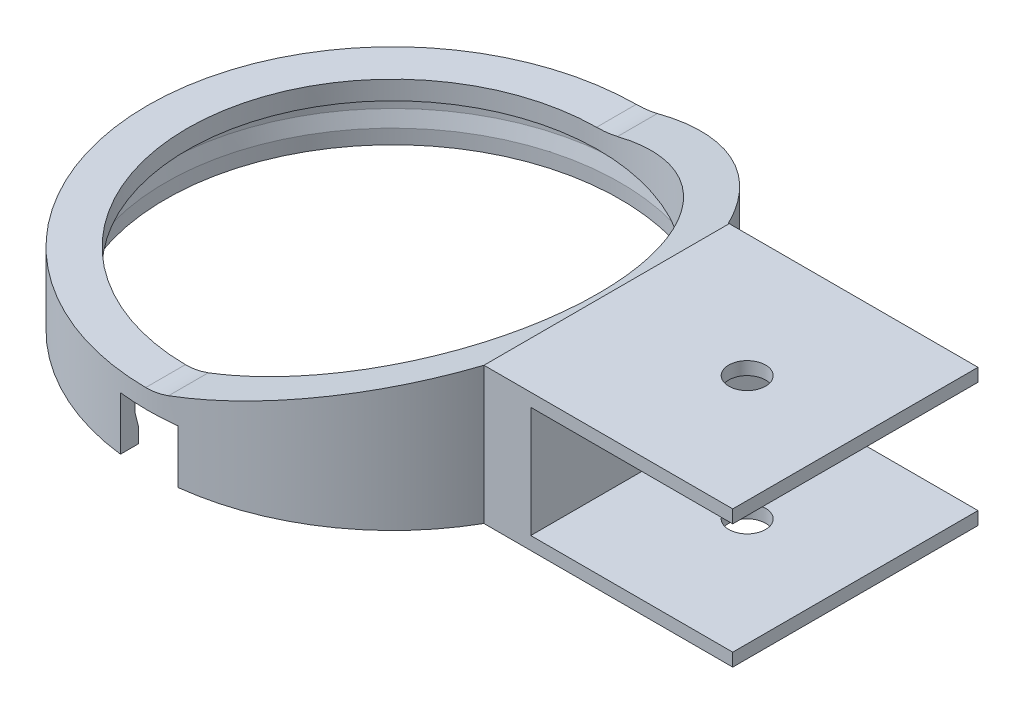
ISO-10303-21;
HEADER;
FILE_DESCRIPTION(('STEP AP214'),'2;1');
FILE_NAME('part.step','',(''),(''),'','','');
FILE_SCHEMA(('AUTOMOTIVE_DESIGN { 1 0 10303 214 1 1 1 1 }'));
ENDSEC;
DATA;
#1=APPLICATION_CONTEXT('core data for automotive mechanical design processes');
#2=APPLICATION_PROTOCOL_DEFINITION('international standard','automotive_design',2000,#1);
#3=PRODUCT_CONTEXT('',#1,'mechanical');
#4=PRODUCT('Part','Part','',(#3));
#5=PRODUCT_RELATED_PRODUCT_CATEGORY('part','',(#4));
#6=PRODUCT_DEFINITION_FORMATION('','',#4);
#7=PRODUCT_DEFINITION_CONTEXT('part definition',#1,'design');
#8=PRODUCT_DEFINITION('design','',#6,#7);
#9=PRODUCT_DEFINITION_SHAPE('','',#8);
#10=(LENGTH_UNIT() NAMED_UNIT(*) SI_UNIT(.MILLI.,.METRE.));
#11=(NAMED_UNIT(*) PLANE_ANGLE_UNIT() SI_UNIT($,.RADIAN.));
#12=(NAMED_UNIT(*) SI_UNIT($,.STERADIAN.) SOLID_ANGLE_UNIT());
#13=UNCERTAINTY_MEASURE_WITH_UNIT(LENGTH_MEASURE(1.E-05),#10,'distance_accuracy_value','');
#14=(GEOMETRIC_REPRESENTATION_CONTEXT(3) GLOBAL_UNCERTAINTY_ASSIGNED_CONTEXT((#13)) GLOBAL_UNIT_ASSIGNED_CONTEXT((#10,
#11,#12)) REPRESENTATION_CONTEXT('',''));
#15=CARTESIAN_POINT('',(0.,0.,0.));
#16=DIRECTION('',(0.,0.,1.));
#17=DIRECTION('',(1.,0.,0.));
#18=AXIS2_PLACEMENT_3D('',#15,#16,#17);
#19=CARTESIAN_POINT('',(81.28,0.,0.));
#20=DIRECTION('',(-1.,0.,0.));
#21=DIRECTION('',(0.,0.,1.));
#22=AXIS2_PLACEMENT_3D('',#19,#20,#21);
#23=PLANE('',#22);
#24=DIRECTION('',(0.,1.,0.));
#25=VECTOR('',#24,1.);
#26=CARTESIAN_POINT('',(81.28,14.732,-21.7399323695097));
#27=LINE('',#26,#25);
#28=CARTESIAN_POINT('',(81.28,-9.398,-21.7399323695097));
#29=VERTEX_POINT('',#28);
#30=CARTESIAN_POINT('',(81.28,-7.11200000000001,-21.7399323695097));
#31=VERTEX_POINT('',#30);
#32=EDGE_CURVE('E203',#29,#31,#27,.T.);
#33=ORIENTED_EDGE('',*,*,#32,.T.);
#34=DIRECTION('',(0.,0.,-1.));
#35=VECTOR('',#34,1.);
#36=CARTESIAN_POINT('',(81.28,-7.11200000000001,19.1540676304903));
#37=LINE('',#36,#35);
#38=CARTESIAN_POINT('',(81.28,-7.11200000000001,21.4400676304903));
#39=VERTEX_POINT('',#38);
#40=EDGE_CURVE('E178',#39,#31,#37,.T.);
#41=ORIENTED_EDGE('',*,*,#40,.F.);
#42=DIRECTION('',(0.,-1.,0.));
#43=VECTOR('',#42,1.);
#44=CARTESIAN_POINT('',(81.28,-9.39800000000001,21.4400676304903));
#45=LINE('',#44,#43);
#46=CARTESIAN_POINT('',(81.28,-9.39800000000001,21.4400676304903));
#47=VERTEX_POINT('',#46);
#48=EDGE_CURVE('E195',#39,#47,#45,.T.);
#49=ORIENTED_EDGE('',*,*,#48,.T.);
#50=DIRECTION('',(0.,0.,-1.));
#51=VECTOR('',#50,1.);
#52=CARTESIAN_POINT('',(81.28,-9.398,-21.7399323695097));
#53=LINE('',#52,#51);
#54=EDGE_CURVE('E194',#47,#29,#53,.T.);
#55=ORIENTED_EDGE('',*,*,#54,.T.);
#56=EDGE_LOOP('',(#33,#41,#49,#55));
#57=FACE_BOUND('',#56,.T.);
#58=ADVANCED_FACE('F35',(#57),#23,.F.);
#59=CARTESIAN_POINT('',(0.,2.54,0.));
#60=DIRECTION('',(0.,-1.,0.));
#61=DIRECTION('',(0.,0.,-1.));
#62=AXIS2_PLACEMENT_3D('',#59,#60,#61);
#63=CYLINDRICAL_SURFACE('',#62,43.18);
#64=DIRECTION('',(0.,-1.,0.));
#65=VECTOR('',#64,1.);
#66=CARTESIAN_POINT('',(37.4811405909692,2.54,21.4400676304903));
#67=LINE('',#66,#65);
#68=CARTESIAN_POINT('',(37.4811405909692,14.732,21.4400676304903));
#69=VERTEX_POINT('',#68);
#70=CARTESIAN_POINT('',(37.4811405909692,-9.39800000000001,21.4400676304903));
#71=VERTEX_POINT('',#70);
#72=EDGE_CURVE('E207',#69,#71,#67,.T.);
#73=ORIENTED_EDGE('',*,*,#72,.F.);
#74=CARTESIAN_POINT('',(0.,2.77504537316538,0.));
#75=DIRECTION('',(0.303922257004754,-0.952696836195616,0.));
#76=DIRECTION('',(-0.952696836195616,-0.303922257004754,0.));
#77=AXIS2_PLACEMENT_3D('',#74,#75,#76);
#78=ELLIPSE('',#77,45.3239670370165,43.18);
#79=CARTESIAN_POINT('',(3.53498559968209,3.90275018031569,43.0350586941628));
#80=VERTEX_POINT('',#79);
#81=EDGE_CURVE('E368',#69,#80,#78,.T.);
#82=ORIENTED_EDGE('',*,*,#81,.T.);
#83=CARTESIAN_POINT('',(3.53498559968207,3.90275018031568,43.0350586941628));
#84=CARTESIAN_POINT('',(3.22329552847197,3.80328461185892,43.0606883849366));
#85=CARTESIAN_POINT('',(2.90750022065759,3.71584549613488,43.0831924459342));
#86=CARTESIAN_POINT('',(2.27175021436152,3.56602113296972,43.1213606609253));
#87=CARTESIAN_POINT('',(1.95183485287706,3.50347975941223,43.1370674941495));
#88=CARTESIAN_POINT('',(1.30786629135085,3.40317095125314,43.1613910578396));
#89=CARTESIAN_POINT('',(0.983813026859318,3.36540390300428,43.170007677735));
#90=CARTESIAN_POINT('',(0.331566724703802,3.31472101850829,43.1799743072779));
#91=CARTESIAN_POINT('',(0.00336046589336663,3.30196613620834,43.181277353077));
#92=CARTESIAN_POINT('',(-0.324827064278304,3.302,43.178778206178));
#93=B_SPLINE_CURVE_WITH_KNOTS('',3,(#83,#84,#85,#86,#87,#88,#89,#90,#91,#92),.UNSPECIFIED.,.F.,
.F.,(4,2,2,2,4),(0.,0.984290926234504,1.96230858957677,2.94034150462912,3.92464769882305),.UNSPECIFIED.);
#94=CARTESIAN_POINT('',(-0.324827064278305,3.302,43.178778206178));
#95=VERTEX_POINT('',#94);
#96=EDGE_CURVE('E62',#80,#95,#93,.T.);
#97=ORIENTED_EDGE('',*,*,#96,.T.);
#98=CARTESIAN_POINT('',(0.,3.302,0.));
#99=DIRECTION('',(0.,-1.,0.));
#100=DIRECTION('',(0.,0.,-1.));
#101=AXIS2_PLACEMENT_3D('',#98,#99,#100);
#102=CIRCLE('',#101,43.18);
#103=CARTESIAN_POINT('',(-0.324827064278305,3.302,-43.178778206178));
#104=VERTEX_POINT('',#103);
#105=EDGE_CURVE('E370',#95,#104,#102,.T.);
#106=ORIENTED_EDGE('',*,*,#105,.T.);
#107=CARTESIAN_POINT('',(-0.324827064278305,3.302,-43.178778206178));
#108=CARTESIAN_POINT('',(0.0033604658933656,3.30196613620835,-43.181277353077));
#109=CARTESIAN_POINT('',(0.331566724703801,3.31472101850829,-43.1799743072779));
#110=CARTESIAN_POINT('',(0.983813026859319,3.36540390300428,-43.170007677735));
#111=CARTESIAN_POINT('',(1.30786629135085,3.40317095125314,-43.1613910578396));
#112=CARTESIAN_POINT('',(1.95183485287706,3.50347975941223,-43.1370674941495));
#113=CARTESIAN_POINT('',(2.27175021436152,3.56602113296972,-43.1213606609253));
#114=CARTESIAN_POINT('',(2.90750022065759,3.71584549613488,-43.0831924459342));
#115=CARTESIAN_POINT('',(3.22329552847197,3.80328461185892,-43.0606883849366));
#116=CARTESIAN_POINT('',(3.53498559968208,3.90275018031568,-43.0350586941628));
#117=B_SPLINE_CURVE_WITH_KNOTS('',3,(#107,#108,#109,#110,#111,#112,#113,#114,#115,#116),
.UNSPECIFIED.,.F.,.F.,(4,2,2,2,4),(0.,0.984306194193926,1.96233910924628,2.94035677258854,
3.92464769882305),.UNSPECIFIED.);
#118=CARTESIAN_POINT('',(3.53498559968207,3.90275018031568,-43.0350586941628));
#119=VERTEX_POINT('',#118);
#120=EDGE_CURVE('E11',#104,#119,#117,.T.);
#121=ORIENTED_EDGE('',*,*,#120,.T.);
#122=CARTESIAN_POINT('',(37.3080117477684,14.6767697244172,-21.7399323695097));
#123=VERTEX_POINT('',#122);
#124=EDGE_CURVE('E365',#119,#123,#78,.T.);
#125=ORIENTED_EDGE('',*,*,#124,.T.);
#126=DIRECTION('',(0.,-1.,0.));
#127=VECTOR('',#126,1.);
#128=CARTESIAN_POINT('',(37.3080117477352,2.54,-21.7399323695096));
#129=LINE('',#128,#127);
#130=CARTESIAN_POINT('',(37.3080117477116,-9.398,-21.7399323695097));
#131=VERTEX_POINT('',#130);
#132=EDGE_CURVE('E218',#131,#123,#129,.F.);
#133=ORIENTED_EDGE('',*,*,#132,.F.);
#134=CARTESIAN_POINT('',(0.,-9.39800000000001,0.));
#135=DIRECTION('',(0.,-1.,0.));
#136=DIRECTION('',(0.,0.,-1.));
#137=AXIS2_PLACEMENT_3D('',#134,#135,#136);
#138=CIRCLE('',#137,43.18);
#139=CARTESIAN_POINT('',(-5.08,-9.39800000000001,42.8801352609807));
#140=VERTEX_POINT('',#139);
#141=EDGE_CURVE('E262',#140,#131,#138,.T.);
#142=ORIENTED_EDGE('',*,*,#141,.F.);
#143=DIRECTION('',(0.,-1.,0.));
#144=VECTOR('',#143,1.);
#145=CARTESIAN_POINT('',(-5.08,2.54,42.8801352609807));
#146=LINE('',#145,#144);
#147=CARTESIAN_POINT('',(-5.08,0.,42.8801352609807));
#148=VERTEX_POINT('',#147);
#149=EDGE_CURVE('E247',#140,#148,#146,.F.);
#150=ORIENTED_EDGE('',*,*,#149,.T.);
#151=CARTESIAN_POINT('',(0.,0.,0.));
#152=DIRECTION('',(0.,1.,0.));
#153=DIRECTION('',(-1.,0.,0.));
#154=AXIS2_PLACEMENT_3D('',#151,#152,#153);
#155=CIRCLE('',#154,43.18);
#156=CARTESIAN_POINT('',(5.08,0.,42.8801352609807));
#157=VERTEX_POINT('',#156);
#158=EDGE_CURVE('E250',#148,#157,#155,.T.);
#159=ORIENTED_EDGE('',*,*,#158,.T.);
#160=DIRECTION('',(0.,-1.,0.));
#161=VECTOR('',#160,1.);
#162=CARTESIAN_POINT('',(5.08,2.54,42.8801352609807));
#163=LINE('',#162,#161);
#164=CARTESIAN_POINT('',(5.08,-9.39800000000001,42.8801352609807));
#165=VERTEX_POINT('',#164);
#166=EDGE_CURVE('E238',#165,#157,#163,.F.);
#167=ORIENTED_EDGE('',*,*,#166,.F.);
#168=EDGE_CURVE('E261',#71,#165,#138,.T.);
#169=ORIENTED_EDGE('',*,*,#168,.F.);
#170=EDGE_LOOP('',(#73,#82,#97,#106,#121,#125,#133,#142,#150,#159,#167,#169));
#171=FACE_BOUND('',#170,.T.);
#172=ADVANCED_FACE('F338',(#171),#63,.T.);
#173=CARTESIAN_POINT('',(0.,2.54,0.));
#174=DIRECTION('',(0.,-1.,0.));
#175=DIRECTION('',(0.,0.,-1.));
#176=AXIS2_PLACEMENT_3D('',#173,#174,#175);
#177=CYLINDRICAL_SURFACE('',#176,36.195);
#178=CARTESIAN_POINT('',(0.,2.77504537316538,0.));
#179=DIRECTION('',(0.303922257004754,-0.952696836195616,0.));
#180=DIRECTION('',(-0.952696836195616,-0.303922257004754,0.));
#181=AXIS2_PLACEMENT_3D('',#178,#179,#180);
#182=ELLIPSE('',#181,37.9921488398521,36.195);
#183=CARTESIAN_POINT('',(3.53498559968207,3.90275018031568,-36.0219641581361));
#184=VERTEX_POINT('',#183);
#185=CARTESIAN_POINT('',(3.53498559968207,3.90275018031568,36.0219641581361));
#186=VERTEX_POINT('',#185);
#187=EDGE_CURVE('E367',#184,#186,#182,.T.);
#188=ORIENTED_EDGE('',*,*,#187,.F.);
#189=CARTESIAN_POINT('',(3.53498559968207,3.90275018031568,-36.0219641581361));
#190=CARTESIAN_POINT('',(3.22354671856189,3.80336214986623,-36.0525590280445));
#191=CARTESIAN_POINT('',(2.90790194474935,3.71595247560489,-36.0794244613593));
#192=CARTESIAN_POINT('',(2.27235402958867,3.56615124724148,-36.124987176148));
#193=CARTESIAN_POINT('',(1.95249244772905,3.50359921857052,-36.1437369229716));
#194=CARTESIAN_POINT('',(1.30851394066261,3.40325484168963,-36.1727752809046));
#195=CARTESIAN_POINT('',(0.984396921212478,3.36546304278039,-36.1830637043024));
#196=CARTESIAN_POINT('',(0.331910771987549,3.31473388710472,-36.1949678203337));
#197=CARTESIAN_POINT('',(0.00352769705809773,3.30196242312623,-36.1965257527722));
#198=CARTESIAN_POINT('',(-0.324827064278305,3.302,-36.1935424126779));
#199=B_SPLINE_CURVE_WITH_KNOTS('',3,(#189,#190,#191,#192,#193,#194,#195,#196,#197,#198),
.UNSPECIFIED.,.F.,.F.,(4,2,2,2,4),(0.,0.984784526100825,1.96310402845409,2.94144523389318,
3.92625148897067),.UNSPECIFIED.);
#200=CARTESIAN_POINT('',(-0.324827064278305,3.302,-36.1935424126779));
#201=VERTEX_POINT('',#200);
#202=EDGE_CURVE('E48',#184,#201,#199,.T.);
#203=ORIENTED_EDGE('',*,*,#202,.T.);
#204=CARTESIAN_POINT('',(0.,3.302,0.));
#205=DIRECTION('',(0.,-1.,0.));
#206=DIRECTION('',(0.,0.,-1.));
#207=AXIS2_PLACEMENT_3D('',#204,#205,#206);
#208=CIRCLE('',#207,36.195);
#209=CARTESIAN_POINT('',(-0.324827064278305,3.302,36.1935424126779));
#210=VERTEX_POINT('',#209);
#211=EDGE_CURVE('E396',#210,#201,#208,.T.);
#212=ORIENTED_EDGE('',*,*,#211,.F.);
#213=CARTESIAN_POINT('',(-0.324827064278305,3.302,36.1935424126779));
#214=CARTESIAN_POINT('',(0.00352769705809779,3.30196242312623,36.1965257527722));
#215=CARTESIAN_POINT('',(0.331910771987549,3.31473388710472,36.1949678203337));
#216=CARTESIAN_POINT('',(0.984396921212479,3.36546304278039,36.1830637043024));
#217=CARTESIAN_POINT('',(1.30851394066262,3.40325484168963,36.1727752809046));
#218=CARTESIAN_POINT('',(1.95249244772905,3.50359921857052,36.1437369229716));
#219=CARTESIAN_POINT('',(2.27235402958867,3.56615124724148,36.124987176148));
#220=CARTESIAN_POINT('',(2.90790194474935,3.71595247560489,36.0794244613593));
#221=CARTESIAN_POINT('',(3.22354671856189,3.80336214986623,36.0525590280445));
#222=CARTESIAN_POINT('',(3.53498559968207,3.90275018031568,36.0219641581361));
#223=B_SPLINE_CURVE_WITH_KNOTS('',3,(#213,#214,#215,#216,#217,#218,#219,#220,#221,#222),
.UNSPECIFIED.,.F.,.F.,(4,2,2,2,4),(0.,0.984806255077492,1.96314746051658,2.94146696286984,
3.92625148897067),.UNSPECIFIED.);
#224=EDGE_CURVE('E431',#210,#186,#223,.T.);
#225=ORIENTED_EDGE('',*,*,#224,.T.);
#226=EDGE_LOOP('',(#188,#203,#212,#225));
#227=FACE_BOUND('',#226,.T.);
#228=CARTESIAN_POINT('',(0.,0.,0.));
#229=DIRECTION('',(0.,1.,0.));
#230=DIRECTION('',(0.,0.,1.));
#231=AXIS2_PLACEMENT_3D('',#228,#229,#230);
#232=CIRCLE('',#231,36.195);
#233=CARTESIAN_POINT('',(0.,0.,36.195));
#234=VERTEX_POINT('',#233);
#235=EDGE_CURVE('E268',#234,#234,#232,.T.);
#236=ORIENTED_EDGE('',*,*,#235,.F.);
#237=EDGE_LOOP('',(#236));
#238=FACE_BOUND('',#237,.T.);
#239=ADVANCED_FACE('F344',(#227,#238),#177,.F.);
#240=CARTESIAN_POINT('',(0.,0.,0.));
#241=DIRECTION('',(0.,1.,0.));
#242=DIRECTION('',(0.,0.,1.));
#243=AXIS2_PLACEMENT_3D('',#240,#241,#242);
#244=PLANE('',#243);
#245=DIRECTION('',(0.,0.,1.));
#246=VECTOR('',#245,1.);
#247=CARTESIAN_POINT('',(-5.08,0.,30.48));
#248=LINE('',#247,#246);
#249=CARTESIAN_POINT('',(-5.08,0.,40.3212499806244));
#250=VERTEX_POINT('',#249);
#251=EDGE_CURVE('E224',#250,#148,#248,.T.);
#252=ORIENTED_EDGE('',*,*,#251,.F.);
#253=CARTESIAN_POINT('',(0.,0.,0.));
#254=DIRECTION('',(0.,-1.,0.));
#255=DIRECTION('',(0.,0.,-1.));
#256=AXIS2_PLACEMENT_3D('',#253,#254,#255);
#257=CIRCLE('',#256,40.64);
#258=CARTESIAN_POINT('',(5.08,0.,40.3212499806244));
#259=VERTEX_POINT('',#258);
#260=EDGE_CURVE('E265',#250,#259,#257,.T.);
#261=ORIENTED_EDGE('',*,*,#260,.T.);
#262=DIRECTION('',(0.,0.,1.));
#263=VECTOR('',#262,1.);
#264=CARTESIAN_POINT('',(5.08,0.,30.48));
#265=LINE('',#264,#263);
#266=EDGE_CURVE('E223',#259,#157,#265,.T.);
#267=ORIENTED_EDGE('',*,*,#266,.T.);
#268=ORIENTED_EDGE('',*,*,#158,.F.);
#269=EDGE_LOOP('',(#252,#261,#267,#268));
#270=FACE_BOUND('',#269,.T.);
#271=ORIENTED_EDGE('',*,*,#235,.T.);
#272=EDGE_LOOP('',(#271));
#273=FACE_BOUND('',#272,.T.);
#274=ADVANCED_FACE('F414',(#270,#273),#244,.F.);
#275=CARTESIAN_POINT('',(0.,-4.318,0.));
#276=DIRECTION('',(0.,1.,0.));
#277=DIRECTION('',(0.,0.,1.));
#278=AXIS2_PLACEMENT_3D('',#275,#276,#277);
#279=CYLINDRICAL_SURFACE('',#278,40.64);
#280=DIRECTION('',(0.,1.,0.));
#281=VECTOR('',#280,1.);
#282=CARTESIAN_POINT('',(-5.08,-4.318,40.3212499806244));
#283=LINE('',#282,#281);
#284=CARTESIAN_POINT('',(-5.08,-4.318,40.3212499806244));
#285=VERTEX_POINT('',#284);
#286=EDGE_CURVE('E245',#285,#250,#283,.T.);
#287=ORIENTED_EDGE('',*,*,#286,.F.);
#288=CARTESIAN_POINT('',(0.,-4.318,0.));
#289=DIRECTION('',(0.,-1.,0.));
#290=DIRECTION('',(0.,0.,-1.));
#291=AXIS2_PLACEMENT_3D('',#288,#289,#290);
#292=CIRCLE('',#291,40.64);
#293=CARTESIAN_POINT('',(5.08,-4.318,40.3212499806244));
#294=VERTEX_POINT('',#293);
#295=EDGE_CURVE('E252',#285,#294,#292,.T.);
#296=ORIENTED_EDGE('',*,*,#295,.T.);
#297=DIRECTION('',(0.,1.,0.));
#298=VECTOR('',#297,1.);
#299=CARTESIAN_POINT('',(5.08,-4.318,40.3212499806244));
#300=LINE('',#299,#298);
#301=EDGE_CURVE('E235',#294,#259,#300,.T.);
#302=ORIENTED_EDGE('',*,*,#301,.T.);
#303=ORIENTED_EDGE('',*,*,#260,.F.);
#304=EDGE_LOOP('',(#287,#296,#302,#303));
#305=FACE_BOUND('',#304,.T.);
#306=ADVANCED_FACE('F412',(#305),#279,.F.);
#307=CARTESIAN_POINT('',(0.,-9.39800000000001,0.));
#308=DIRECTION('',(0.,-1.,0.));
#309=DIRECTION('',(0.,0.,-1.));
#310=AXIS2_PLACEMENT_3D('',#307,#308,#309);
#311=PLANE('',#310);
#312=CARTESIAN_POINT('',(62.23,-9.39800000000001,-0.149932369509652));
#313=DIRECTION('',(0.,-1.,0.));
#314=DIRECTION('',(0.,0.,-1.));
#315=AXIS2_PLACEMENT_3D('',#312,#313,#314);
#316=CIRCLE('',#315,3.23850000000001);
#317=CARTESIAN_POINT('',(62.23,-9.39800000000001,-3.38843236950966));
#318=VERTEX_POINT('',#317);
#319=EDGE_CURVE('E179',#318,#318,#316,.T.);
#320=ORIENTED_EDGE('',*,*,#319,.F.);
#321=EDGE_LOOP('',(#320));
#322=FACE_BOUND('',#321,.T.);
#323=DIRECTION('',(0.,0.,-1.));
#324=VECTOR('',#323,1.);
#325=CARTESIAN_POINT('',(-5.08,-9.39800000000001,0.));
#326=LINE('',#325,#324);
#327=CARTESIAN_POINT('',(-5.08,-9.39800000000001,39.6811494919187));
#328=VERTEX_POINT('',#327);
#329=EDGE_CURVE('E243',#140,#328,#326,.T.);
#330=ORIENTED_EDGE('',*,*,#329,.F.);
#331=ORIENTED_EDGE('',*,*,#141,.T.);
#332=DIRECTION('',(1.,0.,0.));
#333=VECTOR('',#332,1.);
#334=CARTESIAN_POINT('',(-500000.,-9.398,-21.7399323695097));
#335=LINE('',#334,#333);
#336=EDGE_CURVE('E216',#131,#29,#335,.T.);
#337=ORIENTED_EDGE('',*,*,#336,.T.);
#338=ORIENTED_EDGE('',*,*,#54,.F.);
#339=DIRECTION('',(1.,0.,0.));
#340=VECTOR('',#339,1.);
#341=CARTESIAN_POINT('',(-500000.,-9.39800000000001,21.4400676304903));
#342=LINE('',#341,#340);
#343=EDGE_CURVE('E210',#71,#47,#342,.T.);
#344=ORIENTED_EDGE('',*,*,#343,.F.);
#345=ORIENTED_EDGE('',*,*,#168,.T.);
#346=DIRECTION('',(0.,0.,-1.));
#347=VECTOR('',#346,1.);
#348=CARTESIAN_POINT('',(5.08,-9.39800000000001,0.));
#349=LINE('',#348,#347);
#350=CARTESIAN_POINT('',(5.08,-9.39800000000001,39.6811494919187));
#351=VERTEX_POINT('',#350);
#352=EDGE_CURVE('E232',#165,#351,#349,.T.);
#353=ORIENTED_EDGE('',*,*,#352,.T.);
#354=CARTESIAN_POINT('',(0.,-9.39800000000001,0.));
#355=DIRECTION('',(0.,-1.,0.));
#356=DIRECTION('',(0.,0.,-1.));
#357=AXIS2_PLACEMENT_3D('',#354,#355,#356);
#358=CIRCLE('',#357,40.005);
#359=EDGE_CURVE('E258',#328,#351,#358,.T.);
#360=ORIENTED_EDGE('',*,*,#359,.F.);
#361=EDGE_LOOP('',(#330,#331,#337,#338,#344,#345,#353,#360));
#362=FACE_BOUND('',#361,.T.);
#363=ADVANCED_FACE('F388',(#322,#362),#311,.T.);
#364=CARTESIAN_POINT('',(0.,0.,0.));
#365=DIRECTION('',(0.,-1.,0.));
#366=DIRECTION('',(0.,0.,-1.));
#367=AXIS2_PLACEMENT_3D('',#364,#365,#366);
#368=CYLINDRICAL_SURFACE('',#367,40.005);
#369=DIRECTION('',(0.,-1.,0.));
#370=VECTOR('',#369,1.);
#371=CARTESIAN_POINT('',(-5.08,0.,39.6811494919187));
#372=LINE('',#371,#370);
#373=CARTESIAN_POINT('',(-5.08,-6.858,39.6811494919187));
#374=VERTEX_POINT('',#373);
#375=EDGE_CURVE('E241',#328,#374,#372,.F.);
#376=ORIENTED_EDGE('',*,*,#375,.F.);
#377=ORIENTED_EDGE('',*,*,#359,.T.);
#378=DIRECTION('',(0.,-1.,0.));
#379=VECTOR('',#378,1.);
#380=CARTESIAN_POINT('',(5.08,0.,39.6811494919187));
#381=LINE('',#380,#379);
#382=CARTESIAN_POINT('',(5.08,-6.858,39.6811494919187));
#383=VERTEX_POINT('',#382);
#384=EDGE_CURVE('E227',#351,#383,#381,.F.);
#385=ORIENTED_EDGE('',*,*,#384,.T.);
#386=CARTESIAN_POINT('',(0.,-6.858,0.));
#387=DIRECTION('',(0.,-1.,0.));
#388=DIRECTION('',(0.,0.,-1.));
#389=AXIS2_PLACEMENT_3D('',#386,#387,#388);
#390=CIRCLE('',#389,40.005);
#391=EDGE_CURVE('E255',#374,#383,#390,.T.);
#392=ORIENTED_EDGE('',*,*,#391,.F.);
#393=EDGE_LOOP('',(#376,#377,#385,#392));
#394=FACE_BOUND('',#393,.T.);
#395=ADVANCED_FACE('F404',(#394),#368,.F.);
#396=CARTESIAN_POINT('',(0.,-4.318,0.));
#397=DIRECTION('',(0.,1.,0.));
#398=DIRECTION('',(0.,0.,1.));
#399=AXIS2_PLACEMENT_3D('',#396,#397,#398);
#400=CONICAL_SURFACE('',#399,40.64,0.244978663126863);
#401=CARTESIAN_POINT('',(-5.08,-24.9477051107052,35.1170419876182));
#402=CARTESIAN_POINT('',(-5.08,-21.7462591815245,35.9257261497409));
#403=CARTESIAN_POINT('',(-5.08,-18.5446813482866,36.7338879165323));
#404=CARTESIAN_POINT('',(-5.08,-12.1413025675101,38.3493263565879));
#405=CARTESIAN_POINT('',(-5.08,-8.93950161998342,39.1566030299));
#406=CARTESIAN_POINT('',(-5.08,-2.53571701542766,40.7704310531349));
#407=CARTESIAN_POINT('',(-5.08,0.666266641598179,41.5769824030707));
#408=CARTESIAN_POINT('',(-5.08,7.07038892984463,43.1894703543692));
#409=CARTESIAN_POINT('',(-5.08,10.2725275610736,43.9954069556989));
#410=CARTESIAN_POINT('',(-5.08,13.4747296106588,44.8010914194728));
#411=B_SPLINE_CURVE_WITH_KNOTS('',3,(#401,#402,#403,#404,#405,#406,#407,#408,#409,#410),
.UNSPECIFIED.,.F.,.F.,(4,2,2,2,4),(0.,9.90600992718399,19.8120193188435,29.7180285337309,
39.6240382823562),.UNSPECIFIED.);
#412=EDGE_CURVE('E279',#374,#285,#411,.T.);
#413=ORIENTED_EDGE('',*,*,#412,.F.);
#414=ORIENTED_EDGE('',*,*,#391,.T.);
#415=CARTESIAN_POINT('',(5.08,-24.9477051107052,35.1170419876182));
#416=CARTESIAN_POINT('',(5.08,-21.7462591815245,35.9257261497409));
#417=CARTESIAN_POINT('',(5.08,-18.5446813482866,36.7338879165323));
#418=CARTESIAN_POINT('',(5.08,-12.1413025675101,38.3493263565879));
#419=CARTESIAN_POINT('',(5.08,-8.93950161998341,39.1566030299));
#420=CARTESIAN_POINT('',(5.08,-2.53571701542766,40.7704310531349));
#421=CARTESIAN_POINT('',(5.08,0.666266641598181,41.5769824030707));
#422=CARTESIAN_POINT('',(5.08,7.07038892984463,43.1894703543692));
#423=CARTESIAN_POINT('',(5.08,10.2725275610736,43.9954069556989));
#424=CARTESIAN_POINT('',(5.08,13.4747296106588,44.8010914194728));
#425=B_SPLINE_CURVE_WITH_KNOTS('',3,(#415,#416,#417,#418,#419,#420,#421,#422,#423,#424),
.UNSPECIFIED.,.F.,.F.,(4,2,2,2,4),(0.,9.90600992718399,19.8120193188435,29.7180285337309,
39.6240382823562),.UNSPECIFIED.);
#426=EDGE_CURVE('E271',#383,#294,#425,.T.);
#427=ORIENTED_EDGE('',*,*,#426,.T.);
#428=ORIENTED_EDGE('',*,*,#295,.F.);
#429=EDGE_LOOP('',(#413,#414,#427,#428));
#430=FACE_BOUND('',#429,.T.);
#431=ADVANCED_FACE('F285',(#430),#400,.F.);
#432=CARTESIAN_POINT('',(-5.08,0.,30.48));
#433=DIRECTION('',(-1.,0.,0.));
#434=DIRECTION('',(0.,-1.,0.));
#435=AXIS2_PLACEMENT_3D('',#432,#433,#434);
#436=PLANE('',#435);
#437=ORIENTED_EDGE('',*,*,#329,.T.);
#438=ORIENTED_EDGE('',*,*,#375,.T.);
#439=ORIENTED_EDGE('',*,*,#412,.T.);
#440=ORIENTED_EDGE('',*,*,#286,.T.);
#441=ORIENTED_EDGE('',*,*,#251,.T.);
#442=ORIENTED_EDGE('',*,*,#149,.F.);
#443=EDGE_LOOP('',(#437,#438,#439,#440,#441,#442));
#444=FACE_BOUND('',#443,.T.);
#445=ADVANCED_FACE('F292',(#444),#436,.F.);
#446=CARTESIAN_POINT('',(5.08,0.,30.48));
#447=DIRECTION('',(-1.,0.,0.));
#448=DIRECTION('',(0.,-1.,0.));
#449=AXIS2_PLACEMENT_3D('',#446,#447,#448);
#450=PLANE('',#449);
#451=ORIENTED_EDGE('',*,*,#166,.T.);
#452=ORIENTED_EDGE('',*,*,#266,.F.);
#453=ORIENTED_EDGE('',*,*,#301,.F.);
#454=ORIENTED_EDGE('',*,*,#426,.F.);
#455=ORIENTED_EDGE('',*,*,#384,.F.);
#456=ORIENTED_EDGE('',*,*,#352,.F.);
#457=EDGE_LOOP('',(#451,#452,#453,#454,#455,#456));
#458=FACE_BOUND('',#457,.T.);
#459=ADVANCED_FACE('F288',(#458),#450,.T.);
#460=CARTESIAN_POINT('',(0.,14.732,0.));
#461=DIRECTION('',(0.,1.,0.));
#462=DIRECTION('',(0.,0.,1.));
#463=AXIS2_PLACEMENT_3D('',#460,#461,#462);
#464=PLANE('',#463);
#465=DIRECTION('',(0.,0.,1.));
#466=VECTOR('',#465,1.);
#467=CARTESIAN_POINT('',(37.4811405909692,14.732,-45.72));
#468=LINE('',#467,#466);
#469=CARTESIAN_POINT('',(37.481140590927,14.7319999999904,-21.7399323695097));
#470=VERTEX_POINT('',#469);
#471=EDGE_CURVE('E357',#470,#69,#468,.T.);
#472=ORIENTED_EDGE('',*,*,#471,.T.);
#473=DIRECTION('',(1.,0.,0.));
#474=VECTOR('',#473,1.);
#475=CARTESIAN_POINT('',(-500000.,14.732,21.4400676304903));
#476=LINE('',#475,#474);
#477=CARTESIAN_POINT('',(81.28,14.732,21.4400676304903));
#478=VERTEX_POINT('',#477);
#479=EDGE_CURVE('E213',#69,#478,#476,.T.);
#480=ORIENTED_EDGE('',*,*,#479,.T.);
#481=DIRECTION('',(0.,0.,1.));
#482=VECTOR('',#481,1.);
#483=CARTESIAN_POINT('',(81.28,14.732,21.4400676304903));
#484=LINE('',#483,#482);
#485=CARTESIAN_POINT('',(81.28,14.732,-21.7399323695097));
#486=VERTEX_POINT('',#485);
#487=EDGE_CURVE('E193',#486,#478,#484,.T.);
#488=ORIENTED_EDGE('',*,*,#487,.F.);
#489=DIRECTION('',(1.,0.,0.));
#490=VECTOR('',#489,1.);
#491=CARTESIAN_POINT('',(-500000.,14.732,-21.7399323695097));
#492=LINE('',#491,#490);
#493=EDGE_CURVE('E215',#470,#486,#492,.T.);
#494=ORIENTED_EDGE('',*,*,#493,.F.);
#495=EDGE_LOOP('',(#472,#480,#488,#494));
#496=FACE_BOUND('',#495,.T.);
#497=CARTESIAN_POINT('',(62.23,14.732,-0.149932369509652));
#498=DIRECTION('',(0.,1.,0.));
#499=DIRECTION('',(0.,0.,1.));
#500=AXIS2_PLACEMENT_3D('',#497,#498,#499);
#501=CIRCLE('',#500,3.23850000000001);
#502=CARTESIAN_POINT('',(62.23,14.732,3.08856763049035));
#503=VERTEX_POINT('',#502);
#504=EDGE_CURVE('E372',#503,#503,#501,.T.);
#505=ORIENTED_EDGE('',*,*,#504,.F.);
#506=EDGE_LOOP('',(#505));
#507=FACE_BOUND('',#506,.T.);
#508=ADVANCED_FACE('F291',(#496,#507),#464,.T.);
#509=CARTESIAN_POINT('',(-500000.,-9.398,-21.7399323695097));
#510=DIRECTION('',(0.,0.,-1.));
#511=DIRECTION('',(-1.,0.,0.));
#512=AXIS2_PLACEMENT_3D('',#509,#510,#511);
#513=PLANE('',#512);
#514=DIRECTION('',(-1.,0.,0.));
#515=VECTOR('',#514,1.);
#516=CARTESIAN_POINT('',(-500000.,-7.11200000000001,-21.7399323695097));
#517=LINE('',#516,#515);
#518=CARTESIAN_POINT('',(45.72,-7.11200000000001,-21.7399323695097));
#519=VERTEX_POINT('',#518);
#520=EDGE_CURVE('E352',#31,#519,#517,.T.);
#521=ORIENTED_EDGE('',*,*,#520,.F.);
#522=ORIENTED_EDGE('',*,*,#32,.F.);
#523=ORIENTED_EDGE('',*,*,#336,.F.);
#524=ORIENTED_EDGE('',*,*,#132,.T.);
#525=DIRECTION('',(-0.952696836195616,-0.303922257004754,0.));
#526=VECTOR('',#525,1.);
#527=CARTESIAN_POINT('',(-453819.155502397,-144771.235712399,-21.7399323695097));
#528=LINE('',#527,#526);
#529=EDGE_CURVE('E394',#470,#123,#528,.T.);
#530=ORIENTED_EDGE('',*,*,#529,.F.);
#531=ORIENTED_EDGE('',*,*,#493,.T.);
#532=CARTESIAN_POINT('',(81.28,12.446,-21.7399323695097));
#533=VERTEX_POINT('',#532);
#534=EDGE_CURVE('E198',#533,#486,#27,.T.);
#535=ORIENTED_EDGE('',*,*,#534,.F.);
#536=DIRECTION('',(1.,0.,0.));
#537=VECTOR('',#536,1.);
#538=CARTESIAN_POINT('',(-500000.,12.4459999999512,-21.7399323695097));
#539=LINE('',#538,#537);
#540=CARTESIAN_POINT('',(45.72,12.446,-21.7399323695097));
#541=VERTEX_POINT('',#540);
#542=EDGE_CURVE('E174',#541,#533,#539,.T.);
#543=ORIENTED_EDGE('',*,*,#542,.F.);
#544=DIRECTION('',(0.,1.,0.));
#545=VECTOR('',#544,1.);
#546=CARTESIAN_POINT('',(45.7200000000171,-9.398,-21.7399323695097));
#547=LINE('',#546,#545);
#548=EDGE_CURVE('E354',#519,#541,#547,.T.);
#549=ORIENTED_EDGE('',*,*,#548,.F.);
#550=EDGE_LOOP('',(#521,#522,#523,#524,#530,#531,#535,#543,#549));
#551=FACE_BOUND('',#550,.T.);
#552=ADVANCED_FACE('F300',(#551),#513,.T.);
#553=CARTESIAN_POINT('',(-500000.,14.732,21.4400676304903));
#554=DIRECTION('',(0.,0.,1.));
#555=DIRECTION('',(1.,0.,0.));
#556=AXIS2_PLACEMENT_3D('',#553,#554,#555);
#557=PLANE('',#556);
#558=DIRECTION('',(1.,0.,0.));
#559=VECTOR('',#558,1.);
#560=CARTESIAN_POINT('',(45.72,-7.11200000000001,21.4400676304903));
#561=LINE('',#560,#559);
#562=CARTESIAN_POINT('',(45.72,-7.11200000000001,21.4400676304903));
#563=VERTEX_POINT('',#562);
#564=EDGE_CURVE('E359',#563,#39,#561,.T.);
#565=ORIENTED_EDGE('',*,*,#564,.F.);
#566=DIRECTION('',(0.,-1.,0.));
#567=VECTOR('',#566,1.);
#568=CARTESIAN_POINT('',(45.72,12.446,21.4400676304903));
#569=LINE('',#568,#567);
#570=CARTESIAN_POINT('',(45.72,12.446,21.4400676304903));
#571=VERTEX_POINT('',#570);
#572=EDGE_CURVE('E188',#571,#563,#569,.T.);
#573=ORIENTED_EDGE('',*,*,#572,.F.);
#574=DIRECTION('',(-1.,0.,0.));
#575=VECTOR('',#574,1.);
#576=CARTESIAN_POINT('',(81.28,12.446,21.4400676304903));
#577=LINE('',#576,#575);
#578=CARTESIAN_POINT('',(81.28,12.446,21.4400676304903));
#579=VERTEX_POINT('',#578);
#580=EDGE_CURVE('E171',#579,#571,#577,.T.);
#581=ORIENTED_EDGE('',*,*,#580,.F.);
#582=EDGE_CURVE('E186',#478,#579,#45,.T.);
#583=ORIENTED_EDGE('',*,*,#582,.F.);
#584=ORIENTED_EDGE('',*,*,#479,.F.);
#585=ORIENTED_EDGE('',*,*,#72,.T.);
#586=ORIENTED_EDGE('',*,*,#343,.T.);
#587=ORIENTED_EDGE('',*,*,#48,.F.);
#588=EDGE_LOOP('',(#565,#573,#581,#583,#584,#585,#586,#587));
#589=FACE_BOUND('',#588,.T.);
#590=ADVANCED_FACE('F184',(#589),#557,.T.);
#591=ORIENTED_EDGE('',*,*,#582,.T.);
#592=DIRECTION('',(0.,0.,1.));
#593=VECTOR('',#592,1.);
#594=CARTESIAN_POINT('',(81.28,12.446,-19.4539323695097));
#595=LINE('',#594,#593);
#596=EDGE_CURVE('E168',#533,#579,#595,.T.);
#597=ORIENTED_EDGE('',*,*,#596,.F.);
#598=ORIENTED_EDGE('',*,*,#534,.T.);
#599=ORIENTED_EDGE('',*,*,#487,.T.);
#600=EDGE_LOOP('',(#591,#597,#598,#599));
#601=FACE_BOUND('',#600,.T.);
#602=ADVANCED_FACE('F191',(#601),#23,.F.);
#603=CARTESIAN_POINT('',(45.72,12.446,-19.4539323695097));
#604=DIRECTION('',(0.,1.,0.));
#605=DIRECTION('',(0.,0.,1.));
#606=AXIS2_PLACEMENT_3D('',#603,#604,#605);
#607=PLANE('',#606);
#608=CARTESIAN_POINT('',(62.23,12.446,-0.149932369509652));
#609=DIRECTION('',(0.,1.,0.));
#610=DIRECTION('',(0.,0.,1.));
#611=AXIS2_PLACEMENT_3D('',#608,#609,#610);
#612=CIRCLE('',#611,3.23850000000001);
#613=CARTESIAN_POINT('',(62.23,12.446,3.08856763049035));
#614=VERTEX_POINT('',#613);
#615=EDGE_CURVE('E376',#614,#614,#612,.T.);
#616=ORIENTED_EDGE('',*,*,#615,.T.);
#617=EDGE_LOOP('',(#616));
#618=FACE_BOUND('',#617,.T.);
#619=ORIENTED_EDGE('',*,*,#596,.T.);
#620=ORIENTED_EDGE('',*,*,#580,.T.);
#621=DIRECTION('',(0.,0.,1.));
#622=VECTOR('',#621,1.);
#623=CARTESIAN_POINT('',(45.72,12.446,-19.4539323695097));
#624=LINE('',#623,#622);
#625=EDGE_CURVE('E381',#541,#571,#624,.T.);
#626=ORIENTED_EDGE('',*,*,#625,.F.);
#627=ORIENTED_EDGE('',*,*,#542,.T.);
#628=EDGE_LOOP('',(#619,#620,#626,#627));
#629=FACE_BOUND('',#628,.T.);
#630=ADVANCED_FACE('F170',(#618,#629),#607,.F.);
#631=CARTESIAN_POINT('',(45.72,-7.11200000000001,19.1540676304903));
#632=DIRECTION('',(0.,-1.,0.));
#633=DIRECTION('',(0.,0.,-1.));
#634=AXIS2_PLACEMENT_3D('',#631,#632,#633);
#635=PLANE('',#634);
#636=CARTESIAN_POINT('',(62.23,-7.112,-0.149932369509652));
#637=DIRECTION('',(0.,-1.,0.));
#638=DIRECTION('',(0.,0.,-1.));
#639=AXIS2_PLACEMENT_3D('',#636,#637,#638);
#640=CIRCLE('',#639,3.23850000000001);
#641=CARTESIAN_POINT('',(62.23,-7.112,-3.38843236950966));
#642=VERTEX_POINT('',#641);
#643=EDGE_CURVE('E375',#642,#642,#640,.T.);
#644=ORIENTED_EDGE('',*,*,#643,.T.);
#645=EDGE_LOOP('',(#644));
#646=FACE_BOUND('',#645,.T.);
#647=ORIENTED_EDGE('',*,*,#40,.T.);
#648=ORIENTED_EDGE('',*,*,#520,.T.);
#649=DIRECTION('',(0.,0.,-1.));
#650=VECTOR('',#649,1.);
#651=CARTESIAN_POINT('',(45.72,-7.11200000000001,19.1540676304903));
#652=LINE('',#651,#650);
#653=EDGE_CURVE('E200',#563,#519,#652,.T.);
#654=ORIENTED_EDGE('',*,*,#653,.F.);
#655=ORIENTED_EDGE('',*,*,#564,.T.);
#656=EDGE_LOOP('',(#647,#648,#654,#655));
#657=FACE_BOUND('',#656,.T.);
#658=ADVANCED_FACE('F311',(#646,#657),#635,.F.);
#659=CARTESIAN_POINT('',(45.72,0.,0.));
#660=DIRECTION('',(1.,0.,0.));
#661=DIRECTION('',(0.,0.,-1.));
#662=AXIS2_PLACEMENT_3D('',#659,#660,#661);
#663=PLANE('',#662);
#664=ORIENTED_EDGE('',*,*,#625,.T.);
#665=ORIENTED_EDGE('',*,*,#572,.T.);
#666=ORIENTED_EDGE('',*,*,#653,.T.);
#667=ORIENTED_EDGE('',*,*,#548,.T.);
#668=EDGE_LOOP('',(#664,#665,#666,#667));
#669=FACE_BOUND('',#668,.T.);
#670=ADVANCED_FACE('F315',(#669),#663,.T.);
#671=CARTESIAN_POINT('',(62.23,-20.828,-0.149932369509652));
#672=DIRECTION('',(0.,1.,0.));
#673=DIRECTION('',(0.,0.,1.));
#674=AXIS2_PLACEMENT_3D('',#671,#672,#673);
#675=CYLINDRICAL_SURFACE('',#674,3.23850000000001);
#676=ORIENTED_EDGE('',*,*,#319,.T.);
#677=EDGE_LOOP('',(#676));
#678=FACE_BOUND('',#677,.T.);
#679=ORIENTED_EDGE('',*,*,#643,.F.);
#680=EDGE_LOOP('',(#679));
#681=FACE_BOUND('',#680,.T.);
#682=ADVANCED_FACE('F319',(#678,#681),#675,.F.);
#683=ORIENTED_EDGE('',*,*,#504,.T.);
#684=EDGE_LOOP('',(#683));
#685=FACE_BOUND('',#684,.T.);
#686=ORIENTED_EDGE('',*,*,#615,.F.);
#687=EDGE_LOOP('',(#686));
#688=FACE_BOUND('',#687,.T.);
#689=ADVANCED_FACE('F321',(#685,#688),#675,.F.);
#690=CARTESIAN_POINT('',(1.65183034224485,3.302,-45.72));
#691=DIRECTION('',(0.,-1.,0.));
#692=DIRECTION('',(0.,0.,-1.));
#693=AXIS2_PLACEMENT_3D('',#690,#691,#692);
#694=PLANE('',#693);
#695=ORIENTED_EDGE('',*,*,#105,.F.);
#696=DIRECTION('',(0.,0.,1.));
#697=VECTOR('',#696,1.);
#698=CARTESIAN_POINT('',(-0.324827064278305,3.302,36.1572880830468));
#699=LINE('',#698,#697);
#700=EDGE_CURVE('E441',#95,#210,#699,.F.);
#701=ORIENTED_EDGE('',*,*,#700,.T.);
#702=ORIENTED_EDGE('',*,*,#211,.T.);
#703=DIRECTION('',(0.,0.,1.));
#704=VECTOR('',#703,1.);
#705=CARTESIAN_POINT('',(-0.324827064278305,3.302,-43.1483934407811));
#706=LINE('',#705,#704);
#707=EDGE_CURVE('E55',#201,#104,#706,.F.);
#708=ORIENTED_EDGE('',*,*,#707,.T.);
#709=EDGE_LOOP('',(#695,#701,#702,#708));
#710=FACE_BOUND('',#709,.T.);
#711=ADVANCED_FACE('F324',(#710),#694,.F.);
#712=CARTESIAN_POINT('',(37.4811405909692,14.732,-45.72));
#713=DIRECTION('',(0.303922257004754,-0.952696836195616,0.));
#714=DIRECTION('',(0.952696836195616,0.303922257004754,0.));
#715=AXIS2_PLACEMENT_3D('',#712,#713,#714);
#716=PLANE('',#715);
#717=ORIENTED_EDGE('',*,*,#187,.T.);
#718=DIRECTION('',(0.,0.,1.));
#719=VECTOR('',#718,1.);
#720=CARTESIAN_POINT('',(3.53498559968207,3.90275018031568,43.1483934407811));
#721=LINE('',#720,#719);
#722=EDGE_CURVE('E450',#186,#80,#721,.T.);
#723=ORIENTED_EDGE('',*,*,#722,.T.);
#724=ORIENTED_EDGE('',*,*,#81,.F.);
#725=ORIENTED_EDGE('',*,*,#471,.F.);
#726=ORIENTED_EDGE('',*,*,#529,.T.);
#727=ORIENTED_EDGE('',*,*,#124,.F.);
#728=DIRECTION('',(0.,0.,1.));
#729=VECTOR('',#728,1.);
#730=CARTESIAN_POINT('',(3.53498559968207,3.90275018031568,-36.1572880830468));
#731=LINE('',#730,#729);
#732=EDGE_CURVE('E453',#119,#184,#731,.T.);
#733=ORIENTED_EDGE('',*,*,#732,.T.);
#734=EDGE_LOOP('',(#717,#723,#724,#725,#726,#727,#733));
#735=FACE_BOUND('',#734,.T.);
#736=ADVANCED_FACE('F328',(#735),#716,.F.);
#737=CARTESIAN_POINT('',(-0.324827064278305,16.002,-45.72));
#738=DIRECTION('',(0.,0.,-1.));
#739=DIRECTION('',(-1.,0.,0.));
#740=AXIS2_PLACEMENT_3D('',#737,#738,#739);
#741=CYLINDRICAL_SURFACE('',#740,12.7);
#742=ORIENTED_EDGE('',*,*,#224,.F.);
#743=ORIENTED_EDGE('',*,*,#700,.F.);
#744=ORIENTED_EDGE('',*,*,#96,.F.);
#745=ORIENTED_EDGE('',*,*,#722,.F.);
#746=EDGE_LOOP('',(#742,#743,#744,#745));
#747=FACE_BOUND('',#746,.T.);
#748=ADVANCED_FACE('F330',(#747),#741,.F.);
#749=CARTESIAN_POINT('',(-0.324827064278305,16.002,-45.72));
#750=DIRECTION('',(0.,0.,-1.));
#751=DIRECTION('',(-1.,0.,0.));
#752=AXIS2_PLACEMENT_3D('',#749,#750,#751);
#753=CYLINDRICAL_SURFACE('',#752,12.7);
#754=ORIENTED_EDGE('',*,*,#120,.F.);
#755=ORIENTED_EDGE('',*,*,#707,.F.);
#756=ORIENTED_EDGE('',*,*,#202,.F.);
#757=ORIENTED_EDGE('',*,*,#732,.F.);
#758=EDGE_LOOP('',(#754,#755,#756,#757));
#759=FACE_BOUND('',#758,.T.);
#760=ADVANCED_FACE('F37',(#759),#753,.F.);
#761=CLOSED_SHELL('',(#58,#172,#239,#274,#306,#363,#395,#431,#445,#459,#508,#552,#590,#602,#630,
#658,#670,#682,#689,#711,#736,#748,#760));
#762=MANIFOLD_SOLID_BREP('B2',#761);
#763=ADVANCED_BREP_SHAPE_REPRESENTATION('',(#18,#762),#14);
#764=SHAPE_DEFINITION_REPRESENTATION(#9,#763);
ENDSEC;
END-ISO-10303-21;
